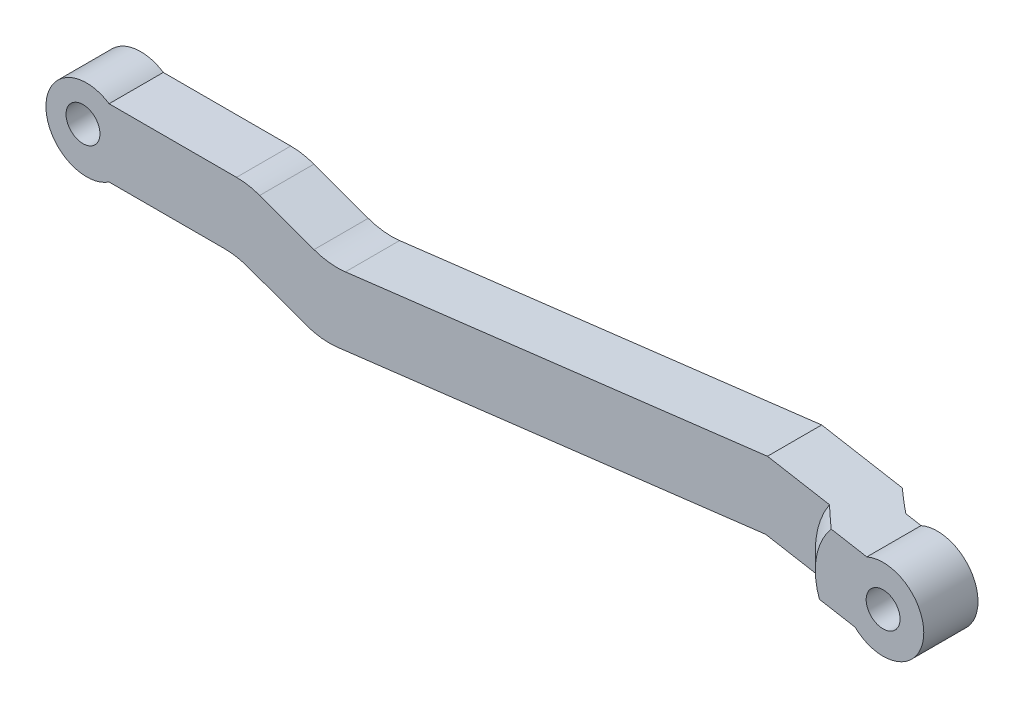
ISO-10303-21;
HEADER;
FILE_DESCRIPTION(('STEP AP214'),'2;1');
FILE_NAME('part.step','',(''),(''),'','','');
FILE_SCHEMA(('AUTOMOTIVE_DESIGN { 1 0 10303 214 1 1 1 1 }'));
ENDSEC;
DATA;
#1=APPLICATION_CONTEXT('core data for automotive mechanical design processes');
#2=APPLICATION_PROTOCOL_DEFINITION('international standard','automotive_design',2000,#1);
#3=PRODUCT_CONTEXT('',#1,'mechanical');
#4=PRODUCT('Part','Part','',(#3));
#5=PRODUCT_RELATED_PRODUCT_CATEGORY('part','',(#4));
#6=PRODUCT_DEFINITION_FORMATION('','',#4);
#7=PRODUCT_DEFINITION_CONTEXT('part definition',#1,'design');
#8=PRODUCT_DEFINITION('design','',#6,#7);
#9=PRODUCT_DEFINITION_SHAPE('','',#8);
#10=(LENGTH_UNIT() NAMED_UNIT(*) SI_UNIT(.MILLI.,.METRE.));
#11=(NAMED_UNIT(*) PLANE_ANGLE_UNIT() SI_UNIT($,.RADIAN.));
#12=(NAMED_UNIT(*) SI_UNIT($,.STERADIAN.) SOLID_ANGLE_UNIT());
#13=UNCERTAINTY_MEASURE_WITH_UNIT(LENGTH_MEASURE(1.E-05),#10,'distance_accuracy_value','');
#14=(GEOMETRIC_REPRESENTATION_CONTEXT(3) GLOBAL_UNCERTAINTY_ASSIGNED_CONTEXT((#13)) GLOBAL_UNIT_ASSIGNED_CONTEXT((#10,
#11,#12)) REPRESENTATION_CONTEXT('',''));
#15=CARTESIAN_POINT('',(0.,0.,0.));
#16=DIRECTION('',(0.,0.,1.));
#17=DIRECTION('',(1.,0.,0.));
#18=AXIS2_PLACEMENT_3D('',#15,#16,#17);
#19=CARTESIAN_POINT('',(0.,0.,4.));
#20=DIRECTION('',(0.,0.,-1.));
#21=DIRECTION('',(-1.,0.,0.));
#22=AXIS2_PLACEMENT_3D('',#19,#20,#21);
#23=CYLINDRICAL_SURFACE('',#22,6.00000000001086);
#24=CARTESIAN_POINT('',(0.,0.,-1.5));
#25=DIRECTION('',(0.,0.,-1.));
#26=DIRECTION('',(-1.,0.,0.));
#27=AXIS2_PLACEMENT_3D('',#24,#25,#26);
#28=CIRCLE('',#27,6.00000000001086);
#29=CARTESIAN_POINT('',(-2.39799691900909,5.49996461593647,-1.5));
#30=VERTEX_POINT('',#29);
#31=CARTESIAN_POINT('',(-4.13447869579307,-4.34811291419606,-1.5));
#32=VERTEX_POINT('',#31);
#33=EDGE_CURVE('E183',#30,#32,#28,.T.);
#34=ORIENTED_EDGE('',*,*,#33,.F.);
#35=DIRECTION('',(0.,0.,-1.));
#36=VECTOR('',#35,1.);
#37=CARTESIAN_POINT('',(-2.3979969189946,5.49996461590325,4.));
#38=LINE('',#37,#36);
#39=CARTESIAN_POINT('',(-2.39799691900909,5.49996461593647,6.50000000000001));
#40=VERTEX_POINT('',#39);
#41=EDGE_CURVE('E179',#40,#30,#38,.T.);
#42=ORIENTED_EDGE('',*,*,#41,.F.);
#43=CARTESIAN_POINT('',(0.,0.,6.5));
#44=DIRECTION('',(0.,0.,-1.));
#45=DIRECTION('',(-1.,0.,0.));
#46=AXIS2_PLACEMENT_3D('',#43,#44,#45);
#47=CIRCLE('',#46,6.00000000001992);
#48=CARTESIAN_POINT('',(-4.13447869577433,-4.34811291417636,6.5));
#49=VERTEX_POINT('',#48);
#50=EDGE_CURVE('E182',#40,#49,#47,.T.);
#51=ORIENTED_EDGE('',*,*,#50,.T.);
#52=DIRECTION('',(0.,0.,-1.));
#53=VECTOR('',#52,1.);
#54=CARTESIAN_POINT('',(-4.13447869579307,-4.34811291419606,4.));
#55=LINE('',#54,#53);
#56=EDGE_CURVE('E239',#49,#32,#55,.T.);
#57=ORIENTED_EDGE('',*,*,#56,.T.);
#58=EDGE_LOOP('',(#34,#42,#51,#57));
#59=FACE_BOUND('',#58,.T.);
#60=ADVANCED_FACE('F51',(#59),#23,.T.);
#61=CARTESIAN_POINT('',(-2.3979969189946,5.49996461590325,4.));
#62=DIRECTION('',(-0.173648177666931,-0.984807753012208,0.));
#63=DIRECTION('',(0.984807753012208,-0.173648177666931,0.));
#64=AXIS2_PLACEMENT_3D('',#61,#62,#63);
#65=PLANE('',#64);
#66=DIRECTION('',(0.984807753012208,-0.173648177666931,0.));
#67=VECTOR('',#66,1.);
#68=CARTESIAN_POINT('',(-2.3979969189946,5.49996461590325,-1.5));
#69=LINE('',#68,#67);
#70=CARTESIAN_POINT('',(-4.63700181292562,5.89476158864158,-1.5));
#71=VERTEX_POINT('',#70);
#72=EDGE_CURVE('E214',#71,#30,#69,.T.);
#73=ORIENTED_EDGE('',*,*,#72,.F.);
#74=CARTESIAN_POINT('',(-4.63700181292562,5.89476158864158,-1.5));
#75=CARTESIAN_POINT('',(-4.76732029656631,5.91774025339245,-1.59864307554178));
#76=CARTESIAN_POINT('',(-4.89691099085917,5.94059058924502,-1.69826879075981));
#77=CARTESIAN_POINT('',(-5.15479478304708,5.98606245969517,-1.89922594129117));
#78=CARTESIAN_POINT('',(-5.28308793961399,6.00868400463817,-2.000557298922));
#79=CARTESIAN_POINT('',(-5.66619408865113,6.07623595518873,-2.30666891352271));
#80=CARTESIAN_POINT('',(-5.91931681422967,6.12086832113869,-2.51363006363108));
#81=CARTESIAN_POINT('',(-6.42199481942784,6.20950401606384,-2.93188669002685));
#82=CARTESIAN_POINT('',(-6.67155056292691,6.25350742683349,-3.14318159385292));
#83=CARTESIAN_POINT('',(-7.0438147140486,6.31914764062678,-3.46268655799088));
#84=CARTESIAN_POINT('',(-7.16757803090698,6.34097045261088,-3.56963310752277));
#85=CARTESIAN_POINT('',(-7.41446957007137,6.3845040922742,-3.78427643626721));
#86=CARTESIAN_POINT('',(-7.5375978002994,6.40621492135029,-3.89197320608199));
#87=CARTESIAN_POINT('',(-7.66044443118978,6.4278760968654,-4.));
#88=B_SPLINE_CURVE_WITH_KNOTS('',3,(#74,#75,#76,#77,#78,#79,#80,#81,#82,#83,#84,#85,#86,#87),
.UNSPECIFIED.,.F.,.F.,(4,2,2,2,2,2,4),(0.,0.495136353628857,0.990250217252274,1.98016159083709,
2.96994303499135,3.46499656313936,3.96004390102446),.UNSPECIFIED.);
#89=CARTESIAN_POINT('',(-7.66044443118978,6.4278760968654,-4.));
#90=VERTEX_POINT('',#89);
#91=EDGE_CURVE('E319',#71,#90,#88,.T.);
#92=ORIENTED_EDGE('',*,*,#91,.T.);
#93=DIRECTION('',(-0.984807753012208,0.173648177666931,0.));
#94=VECTOR('',#93,1.);
#95=CARTESIAN_POINT('',(-2.3979969189946,5.49996461590325,-4.));
#96=LINE('',#95,#94);
#97=CARTESIAN_POINT('',(-19.5610523914674,8.52627436709628,-4.));
#98=VERTEX_POINT('',#97);
#99=EDGE_CURVE('E216',#90,#98,#96,.T.);
#100=ORIENTED_EDGE('',*,*,#99,.T.);
#101=DIRECTION('',(0.,0.,-1.));
#102=VECTOR('',#101,1.);
#103=CARTESIAN_POINT('',(-19.5610523914674,8.52627436709628,4.));
#104=LINE('',#103,#102);
#105=CARTESIAN_POINT('',(-19.5610523914674,8.52627436709628,4.));
#106=VERTEX_POINT('',#105);
#107=EDGE_CURVE('E188',#106,#98,#104,.T.);
#108=ORIENTED_EDGE('',*,*,#107,.F.);
#109=DIRECTION('',(-0.984807753012208,0.173648177666931,0.));
#110=VECTOR('',#109,1.);
#111=CARTESIAN_POINT('',(-2.3979969189946,5.49996461590325,4.));
#112=LINE('',#111,#110);
#113=CARTESIAN_POINT('',(-10.41414929456,6.91342856118569,4.));
#114=VERTEX_POINT('',#113);
#115=EDGE_CURVE('E217',#114,#106,#112,.T.);
#116=ORIENTED_EDGE('',*,*,#115,.F.);
#117=CARTESIAN_POINT('',(-10.41414929456,6.91342856118569,4.));
#118=CARTESIAN_POINT('',(-10.1872039291095,6.87341197011002,4.21119252457082));
#119=CARTESIAN_POINT('',(-9.95977189127952,6.83330956556309,4.421848306276));
#120=CARTESIAN_POINT('',(-9.50373627460469,6.75289818217929,4.84182529317093));
#121=CARTESIAN_POINT('',(-9.2751327527648,6.71258921339394,5.05114656220699));
#122=CARTESIAN_POINT('',(-8.81653066480646,6.63172529187765,5.4682169959713));
#123=CARTESIAN_POINT('',(-8.58653207764933,6.59117033543702,5.6759661368839));
#124=CARTESIAN_POINT('',(-8.12483490156985,6.5097606663773,6.08952940824265));
#125=CARTESIAN_POINT('',(-7.89313623095548,6.4689059393537,6.29534344460506));
#126=CARTESIAN_POINT('',(-7.66044443118978,6.4278760968654,6.50000000000016));
#127=B_SPLINE_CURVE_WITH_KNOTS('',3,(#117,#118,#119,#120,#121,#122,#123,#124,#125,#126),
.UNSPECIFIED.,.F.,.F.,(4,2,2,2,4),(0.,0.937748968141956,1.87545273026997,2.81317066904517,
3.7509339658266),.UNSPECIFIED.);
#128=CARTESIAN_POINT('',(-7.66044443118978,6.4278760968654,6.5));
#129=VERTEX_POINT('',#128);
#130=EDGE_CURVE('E203',#114,#129,#127,.T.);
#131=ORIENTED_EDGE('',*,*,#130,.T.);
#132=DIRECTION('',(0.98480775301319,-0.173648177661364,0.));
#133=VECTOR('',#132,1.);
#134=CARTESIAN_POINT('',(-2.39799691900909,5.49996461593647,6.5));
#135=LINE('',#134,#133);
#136=EDGE_CURVE('E195',#129,#40,#135,.T.);
#137=ORIENTED_EDGE('',*,*,#136,.T.);
#138=ORIENTED_EDGE('',*,*,#41,.T.);
#139=EDGE_LOOP('',(#73,#92,#100,#108,#116,#131,#137,#138));
#140=FACE_BOUND('',#139,.T.);
#141=ADVANCED_FACE('F200',(#140),#65,.F.);
#142=CARTESIAN_POINT('',(-19.5610523914674,8.52627436709628,4.));
#143=DIRECTION('',(0.120779117636236,-0.992679406829321,0.));
#144=DIRECTION('',(0.992679406829321,0.120779117636236,0.));
#145=AXIS2_PLACEMENT_3D('',#142,#143,#144);
#146=PLANE('',#145);
#147=DIRECTION('',(-0.992679406829321,-0.120779117636236,0.));
#148=VECTOR('',#147,1.);
#149=CARTESIAN_POINT('',(-19.5610523914674,8.52627436709628,-4.));
#150=LINE('',#149,#148);
#151=CARTESIAN_POINT('',(-81.8217203359611,0.951030551172543,-4.));
#152=VERTEX_POINT('',#151);
#153=EDGE_CURVE('E241',#98,#152,#150,.T.);
#154=ORIENTED_EDGE('',*,*,#153,.T.);
#155=DIRECTION('',(0.,0.,-1.));
#156=VECTOR('',#155,1.);
#157=CARTESIAN_POINT('',(-81.8217203359611,0.951030551172543,4.));
#158=LINE('',#157,#156);
#159=CARTESIAN_POINT('',(-81.8217203359611,0.951030551172543,4.));
#160=VERTEX_POINT('',#159);
#161=EDGE_CURVE('E352',#152,#160,#158,.F.);
#162=ORIENTED_EDGE('',*,*,#161,.T.);
#163=DIRECTION('',(-0.992679406829321,-0.120779117636236,0.));
#164=VECTOR('',#163,1.);
#165=CARTESIAN_POINT('',(-19.5610523914674,8.52627436709628,4.));
#166=LINE('',#165,#164);
#167=EDGE_CURVE('E219',#106,#160,#166,.T.);
#168=ORIENTED_EDGE('',*,*,#167,.F.);
#169=ORIENTED_EDGE('',*,*,#107,.T.);
#170=EDGE_LOOP('',(#154,#162,#168,#169));
#171=FACE_BOUND('',#170,.T.);
#172=ADVANCED_FACE('F370',(#171),#146,.F.);
#173=CARTESIAN_POINT('',(-84.1991677906299,0.661766964332774,4.));
#174=DIRECTION('',(-0.34202014332567,-0.939692620785908,0.));
#175=DIRECTION('',(0.939692620785908,-0.34202014332567,0.));
#176=AXIS2_PLACEMENT_3D('',#173,#174,#175);
#177=PLANE('',#176);
#178=DIRECTION('',(-0.939692620785908,0.34202014332567,0.));
#179=VECTOR('',#178,1.);
#180=CARTESIAN_POINT('',(-84.1991677906299,0.661766964332774,4.));
#181=LINE('',#180,#179);
#182=CARTESIAN_POINT('',(-86.4497129455801,1.48089841160667,4.));
#183=VERTEX_POINT('',#182);
#184=CARTESIAN_POINT('',(-94.4614334702856,4.39692620785907,4.));
#185=VERTEX_POINT('',#184);
#186=EDGE_CURVE('E223',#183,#185,#181,.T.);
#187=ORIENTED_EDGE('',*,*,#186,.F.);
#188=DIRECTION('',(0.,0.,-1.));
#189=VECTOR('',#188,1.);
#190=CARTESIAN_POINT('',(-86.4497129455801,1.48089841160667,-4.));
#191=LINE('',#190,#189);
#192=CARTESIAN_POINT('',(-86.4497129455801,1.48089841160667,-4.));
#193=VERTEX_POINT('',#192);
#194=EDGE_CURVE('E349',#183,#193,#191,.T.);
#195=ORIENTED_EDGE('',*,*,#194,.T.);
#196=DIRECTION('',(-0.939692620785908,0.34202014332567,0.));
#197=VECTOR('',#196,1.);
#198=CARTESIAN_POINT('',(-84.1991677906299,0.661766964332774,-4.));
#199=LINE('',#198,#197);
#200=CARTESIAN_POINT('',(-94.4614334702856,4.39692620785907,-4.));
#201=VERTEX_POINT('',#200);
#202=EDGE_CURVE('E244',#193,#201,#199,.T.);
#203=ORIENTED_EDGE('',*,*,#202,.T.);
#204=DIRECTION('',(0.,0.,-1.));
#205=VECTOR('',#204,1.);
#206=CARTESIAN_POINT('',(-94.4614334702856,4.39692620785907,4.));
#207=LINE('',#206,#205);
#208=EDGE_CURVE('E347',#201,#185,#207,.F.);
#209=ORIENTED_EDGE('',*,*,#208,.T.);
#210=EDGE_LOOP('',(#187,#195,#203,#209));
#211=FACE_BOUND('',#210,.T.);
#212=ADVANCED_FACE('F378',(#211),#177,.F.);
#213=CARTESIAN_POINT('',(-96.1183650964577,4.99999999999999,4.));
#214=DIRECTION('',(0.,-1.,0.));
#215=DIRECTION('',(1.,0.,0.));
#216=AXIS2_PLACEMENT_3D('',#213,#214,#215);
#217=PLANE('',#216);
#218=DIRECTION('',(-1.,0.,0.));
#219=VECTOR('',#218,1.);
#220=CARTESIAN_POINT('',(-96.1183650964577,4.99999999999999,4.));
#221=LINE('',#220,#219);
#222=CARTESIAN_POINT('',(-97.8816349035423,4.99999999999999,4.));
#223=VERTEX_POINT('',#222);
#224=CARTESIAN_POINT('',(-116.683375209645,5.,4.));
#225=VERTEX_POINT('',#224);
#226=EDGE_CURVE('E225',#223,#225,#221,.T.);
#227=ORIENTED_EDGE('',*,*,#226,.F.);
#228=DIRECTION('',(0.,0.,-1.));
#229=VECTOR('',#228,1.);
#230=CARTESIAN_POINT('',(-97.8816349035423,4.99999999999999,4.));
#231=LINE('',#230,#229);
#232=CARTESIAN_POINT('',(-97.8816349035423,4.99999999999999,-4.));
#233=VERTEX_POINT('',#232);
#234=EDGE_CURVE('E354',#223,#233,#231,.T.);
#235=ORIENTED_EDGE('',*,*,#234,.T.);
#236=DIRECTION('',(-1.,0.,0.));
#237=VECTOR('',#236,1.);
#238=CARTESIAN_POINT('',(-96.1183650964577,4.99999999999999,-4.));
#239=LINE('',#238,#237);
#240=CARTESIAN_POINT('',(-116.683375209645,5.,-4.));
#241=VERTEX_POINT('',#240);
#242=EDGE_CURVE('E247',#233,#241,#239,.T.);
#243=ORIENTED_EDGE('',*,*,#242,.T.);
#244=DIRECTION('',(0.,0.,-1.));
#245=VECTOR('',#244,1.);
#246=CARTESIAN_POINT('',(-116.683375209645,5.,4.));
#247=LINE('',#246,#245);
#248=EDGE_CURVE('E267',#225,#241,#247,.T.);
#249=ORIENTED_EDGE('',*,*,#248,.F.);
#250=EDGE_LOOP('',(#227,#235,#243,#249));
#251=FACE_BOUND('',#250,.T.);
#252=ADVANCED_FACE('F384',(#251),#217,.F.);
#253=CARTESIAN_POINT('',(-120.,0.,4.));
#254=DIRECTION('',(0.,0.,-1.));
#255=DIRECTION('',(-1.,0.,0.));
#256=AXIS2_PLACEMENT_3D('',#253,#254,#255);
#257=CYLINDRICAL_SURFACE('',#256,5.99999999999999);
#258=CARTESIAN_POINT('',(-120.,0.,-4.));
#259=DIRECTION('',(0.,0.,1.));
#260=DIRECTION('',(1.,0.,0.));
#261=AXIS2_PLACEMENT_3D('',#258,#259,#260);
#262=CIRCLE('',#261,5.99999999999999);
#263=CARTESIAN_POINT('',(-116.683375209645,-5.00000000000002,-4.));
#264=VERTEX_POINT('',#263);
#265=EDGE_CURVE('E249',#241,#264,#262,.T.);
#266=ORIENTED_EDGE('',*,*,#265,.T.);
#267=DIRECTION('',(0.,0.,-1.));
#268=VECTOR('',#267,1.);
#269=CARTESIAN_POINT('',(-116.683375209645,-5.00000000000002,4.));
#270=LINE('',#269,#268);
#271=CARTESIAN_POINT('',(-116.683375209645,-5.00000000000002,4.));
#272=VERTEX_POINT('',#271);
#273=EDGE_CURVE('E264',#272,#264,#270,.T.);
#274=ORIENTED_EDGE('',*,*,#273,.F.);
#275=CARTESIAN_POINT('',(-120.,0.,4.));
#276=DIRECTION('',(0.,0.,1.));
#277=DIRECTION('',(1.,0.,0.));
#278=AXIS2_PLACEMENT_3D('',#275,#276,#277);
#279=CIRCLE('',#278,5.99999999999999);
#280=EDGE_CURVE('E227',#225,#272,#279,.T.);
#281=ORIENTED_EDGE('',*,*,#280,.F.);
#282=ORIENTED_EDGE('',*,*,#248,.T.);
#283=EDGE_LOOP('',(#266,#274,#281,#282));
#284=FACE_BOUND('',#283,.T.);
#285=ADVANCED_FACE('F390',(#284),#257,.T.);
#286=CARTESIAN_POINT('',(-97.8816349035423,-5.00000000000001,4.));
#287=DIRECTION('',(0.,1.,0.));
#288=DIRECTION('',(-1.,0.,0.));
#289=AXIS2_PLACEMENT_3D('',#286,#287,#288);
#290=PLANE('',#289);
#291=DIRECTION('',(1.,0.,0.));
#292=VECTOR('',#291,1.);
#293=CARTESIAN_POINT('',(-97.8816349035423,-5.00000000000001,-4.));
#294=LINE('',#293,#292);
#295=CARTESIAN_POINT('',(-99.644904710627,-5.00000000000001,-4.));
#296=VERTEX_POINT('',#295);
#297=EDGE_CURVE('E251',#264,#296,#294,.T.);
#298=ORIENTED_EDGE('',*,*,#297,.T.);
#299=DIRECTION('',(0.,0.,-1.));
#300=VECTOR('',#299,1.);
#301=CARTESIAN_POINT('',(-99.644904710627,-5.00000000000001,4.));
#302=LINE('',#301,#300);
#303=CARTESIAN_POINT('',(-99.644904710627,-5.00000000000001,4.));
#304=VERTEX_POINT('',#303);
#305=EDGE_CURVE('E66',#296,#304,#302,.F.);
#306=ORIENTED_EDGE('',*,*,#305,.T.);
#307=DIRECTION('',(1.,0.,0.));
#308=VECTOR('',#307,1.);
#309=CARTESIAN_POINT('',(-97.8816349035423,-5.00000000000001,4.));
#310=LINE('',#309,#308);
#311=EDGE_CURVE('E229',#272,#304,#310,.T.);
#312=ORIENTED_EDGE('',*,*,#311,.F.);
#313=ORIENTED_EDGE('',*,*,#273,.T.);
#314=EDGE_LOOP('',(#298,#306,#312,#313));
#315=FACE_BOUND('',#314,.T.);
#316=ADVANCED_FACE('F392',(#315),#290,.F.);
#317=CARTESIAN_POINT('',(-85.3688240689364,-9.5542906908002,4.));
#318=DIRECTION('',(0.342020143325669,0.939692620785908,0.));
#319=DIRECTION('',(-0.939692620785908,0.342020143325669,0.));
#320=AXIS2_PLACEMENT_3D('',#317,#318,#319);
#321=PLANE('',#320);
#322=DIRECTION('',(0.939692620785908,-0.342020143325669,0.));
#323=VECTOR('',#322,1.);
#324=CARTESIAN_POINT('',(-85.3688240689364,-9.5542906908002,-4.));
#325=LINE('',#324,#323);
#326=CARTESIAN_POINT('',(-96.2247032773703,-5.60307379214093,-4.));
#327=VERTEX_POINT('',#326);
#328=CARTESIAN_POINT('',(-87.6193692238867,-8.7351592435263,-4.));
#329=VERTEX_POINT('',#328);
#330=EDGE_CURVE('E253',#327,#329,#325,.T.);
#331=ORIENTED_EDGE('',*,*,#330,.T.);
#332=DIRECTION('',(0.,0.,-1.));
#333=VECTOR('',#332,1.);
#334=CARTESIAN_POINT('',(-87.6193692238867,-8.7351592435263,4.));
#335=LINE('',#334,#333);
#336=CARTESIAN_POINT('',(-87.6193692238867,-8.7351592435263,4.));
#337=VERTEX_POINT('',#336);
#338=EDGE_CURVE('E341',#329,#337,#335,.F.);
#339=ORIENTED_EDGE('',*,*,#338,.T.);
#340=DIRECTION('',(0.939692620785908,-0.342020143325669,0.));
#341=VECTOR('',#340,1.);
#342=CARTESIAN_POINT('',(-85.3688240689364,-9.5542906908002,4.));
#343=LINE('',#342,#341);
#344=CARTESIAN_POINT('',(-96.2247032773703,-5.60307379214093,4.));
#345=VERTEX_POINT('',#344);
#346=EDGE_CURVE('E231',#345,#337,#343,.T.);
#347=ORIENTED_EDGE('',*,*,#346,.F.);
#348=DIRECTION('',(0.,0.,-1.));
#349=VECTOR('',#348,1.);
#350=CARTESIAN_POINT('',(-96.2247032773703,-5.60307379214093,-4.));
#351=LINE('',#350,#349);
#352=EDGE_CURVE('E338',#345,#327,#351,.T.);
#353=ORIENTED_EDGE('',*,*,#352,.T.);
#354=EDGE_LOOP('',(#331,#339,#347,#353));
#355=FACE_BOUND('',#354,.T.);
#356=ADVANCED_FACE('F400',(#355),#321,.F.);
#357=CARTESIAN_POINT('',(-19.8312577290209,-1.58034726041906,4.));
#358=DIRECTION('',(-0.120779117636236,0.992679406829321,0.));
#359=DIRECTION('',(-0.992679406829321,-0.120779117636236,0.));
#360=AXIS2_PLACEMENT_3D('',#357,#358,#359);
#361=PLANE('',#360);
#362=DIRECTION('',(0.992679406829321,0.120779117636236,0.));
#363=VECTOR('',#362,1.);
#364=CARTESIAN_POINT('',(-19.8312577290209,-1.58034726041906,4.));
#365=LINE('',#364,#363);
#366=CARTESIAN_POINT('',(-82.9913766142676,-9.26502710396044,4.));
#367=VERTEX_POINT('',#366);
#368=CARTESIAN_POINT('',(-19.8312577290209,-1.58034726041906,4.));
#369=VERTEX_POINT('',#368);
#370=EDGE_CURVE('E234',#367,#369,#365,.T.);
#371=ORIENTED_EDGE('',*,*,#370,.F.);
#372=DIRECTION('',(0.,0.,-1.));
#373=VECTOR('',#372,1.);
#374=CARTESIAN_POINT('',(-82.9913766142676,-9.26502710396044,4.));
#375=LINE('',#374,#373);
#376=CARTESIAN_POINT('',(-82.9913766142676,-9.26502710396044,-4.));
#377=VERTEX_POINT('',#376);
#378=EDGE_CURVE('E331',#367,#377,#375,.T.);
#379=ORIENTED_EDGE('',*,*,#378,.T.);
#380=DIRECTION('',(0.992679406829321,0.120779117636236,0.));
#381=VECTOR('',#380,1.);
#382=CARTESIAN_POINT('',(-19.8312577290209,-1.58034726041906,-4.));
#383=LINE('',#382,#381);
#384=CARTESIAN_POINT('',(-19.8312577290209,-1.58034726041906,-4.));
#385=VERTEX_POINT('',#384);
#386=EDGE_CURVE('E256',#377,#385,#383,.T.);
#387=ORIENTED_EDGE('',*,*,#386,.T.);
#388=DIRECTION('',(0.,0.,-1.));
#389=VECTOR('',#388,1.);
#390=CARTESIAN_POINT('',(-19.8312577290209,-1.58034726041906,4.));
#391=LINE('',#390,#389);
#392=EDGE_CURVE('E261',#369,#385,#391,.T.);
#393=ORIENTED_EDGE('',*,*,#392,.F.);
#394=EDGE_LOOP('',(#371,#379,#387,#393));
#395=FACE_BOUND('',#394,.T.);
#396=ADVANCED_FACE('F408',(#395),#361,.F.);
#397=CARTESIAN_POINT('',(-4.13447869579307,-4.34811291419606,4.));
#398=DIRECTION('',(0.173648177666931,0.984807753012208,0.));
#399=DIRECTION('',(-0.984807753012208,0.173648177666931,0.));
#400=AXIS2_PLACEMENT_3D('',#397,#398,#399);
#401=PLANE('',#400);
#402=DIRECTION('',(0.984807753012208,-0.173648177666931,0.));
#403=VECTOR('',#402,1.);
#404=CARTESIAN_POINT('',(-4.13447869579307,-4.34811291419606,-4.));
#405=LINE('',#404,#403);
#406=CARTESIAN_POINT('',(-9.39692620785908,-3.42020143325669,-4.));
#407=VERTEX_POINT('',#406);
#408=EDGE_CURVE('E220',#385,#407,#405,.T.);
#409=ORIENTED_EDGE('',*,*,#408,.T.);
#410=CARTESIAN_POINT('',(-9.39692620785908,-3.42020143325669,-4.));
#411=CARTESIAN_POINT('',(-9.27407957696871,-3.4418626087718,-3.89197320608199));
#412=CARTESIAN_POINT('',(-9.15095134674068,-3.46357343784788,-3.78427643626721));
#413=CARTESIAN_POINT('',(-8.90405980757629,-3.5071070775112,-3.56963310752277));
#414=CARTESIAN_POINT('',(-8.7802964907179,-3.52892988949531,-3.46268655799088));
#415=CARTESIAN_POINT('',(-8.40803233959621,-3.59457010328859,-3.14318159385292));
#416=CARTESIAN_POINT('',(-8.15847659609715,-3.63857351405824,-2.93188669002685));
#417=CARTESIAN_POINT('',(-7.65579859089898,-3.72720920898339,-2.51363006363108));
#418=CARTESIAN_POINT('',(-7.40267586532043,-3.77184157493335,-2.30666891352271));
#419=CARTESIAN_POINT('',(-7.01956971628329,-3.83939352548392,-2.000557298922));
#420=CARTESIAN_POINT('',(-6.89127655971639,-3.86201507042692,-1.89922594129117));
#421=CARTESIAN_POINT('',(-6.63339276752847,-3.90748694087706,-1.69826879075981));
#422=CARTESIAN_POINT('',(-6.50380207323561,-3.93033727672964,-1.59864307554178));
#423=CARTESIAN_POINT('',(-6.37348358959492,-3.9533159414805,-1.5));
#424=B_SPLINE_CURVE_WITH_KNOTS('',3,(#410,#411,#412,#413,#414,#415,#416,#417,#418,#419,#420,
#421,#422,#423),.UNSPECIFIED.,.F.,.F.,(4,2,2,2,2,2,4),(0.,0.495047337885099,0.990100866033114,
1.97988231018737,2.96979368377219,3.4649075473956,3.96004390102446),.UNSPECIFIED.);
#425=CARTESIAN_POINT('',(-6.37348358959492,-3.9533159414805,-1.5));
#426=VERTEX_POINT('',#425);
#427=EDGE_CURVE('E325',#407,#426,#424,.T.);
#428=ORIENTED_EDGE('',*,*,#427,.T.);
#429=DIRECTION('',(-0.984807753012208,0.173648177666931,0.));
#430=VECTOR('',#429,1.);
#431=CARTESIAN_POINT('',(-4.13447869579307,-4.34811291419606,-1.5));
#432=LINE('',#431,#430);
#433=EDGE_CURVE('E273',#32,#426,#432,.T.);
#434=ORIENTED_EDGE('',*,*,#433,.F.);
#435=ORIENTED_EDGE('',*,*,#56,.F.);
#436=DIRECTION('',(-0.984807753012699,0.173648177664147,0.));
#437=VECTOR('',#436,1.);
#438=CARTESIAN_POINT('',(-9.39692620785908,-3.42020143325669,6.5));
#439=LINE('',#438,#437);
#440=CARTESIAN_POINT('',(-9.39692620785908,-3.42020143325669,6.5));
#441=VERTEX_POINT('',#440);
#442=EDGE_CURVE('E198',#49,#441,#439,.T.);
#443=ORIENTED_EDGE('',*,*,#442,.T.);
#444=CARTESIAN_POINT('',(-9.39692620785908,-3.42020143325669,6.50000000000015));
#445=CARTESIAN_POINT('',(-9.62961800762478,-3.37917159076838,6.29534344460506));
#446=CARTESIAN_POINT('',(-9.86131667823915,-3.33831686374479,6.08952940824265));
#447=CARTESIAN_POINT('',(-10.3230138543186,-3.25690719468507,5.6759661368839));
#448=CARTESIAN_POINT('',(-10.5530124414758,-3.21635223824444,5.4682169959713));
#449=CARTESIAN_POINT('',(-11.0116145294341,-3.13548831672814,5.05114656220699));
#450=CARTESIAN_POINT('',(-11.240218051274,-3.09517934794279,4.84182529317093));
#451=CARTESIAN_POINT('',(-11.6962536679488,-3.014767964559,4.421848306276));
#452=CARTESIAN_POINT('',(-11.9236857057788,-2.97466556001206,4.21119252457081));
#453=CARTESIAN_POINT('',(-12.1506310712293,-2.93464896893639,4.));
#454=B_SPLINE_CURVE_WITH_KNOTS('',3,(#444,#445,#446,#447,#448,#449,#450,#451,#452,#453),
.UNSPECIFIED.,.F.,.F.,(4,2,2,2,4),(0.,0.93776329678142,1.87548123555663,2.81318499768464,
3.7509339658266),.UNSPECIFIED.);
#455=CARTESIAN_POINT('',(-12.1506310712293,-2.93464896893639,4.));
#456=VERTEX_POINT('',#455);
#457=EDGE_CURVE('E278',#441,#456,#454,.T.);
#458=ORIENTED_EDGE('',*,*,#457,.T.);
#459=DIRECTION('',(0.984807753012208,-0.173648177666931,0.));
#460=VECTOR('',#459,1.);
#461=CARTESIAN_POINT('',(-4.13447869579307,-4.34811291419606,4.));
#462=LINE('',#461,#460);
#463=EDGE_CURVE('E236',#369,#456,#462,.T.);
#464=ORIENTED_EDGE('',*,*,#463,.F.);
#465=ORIENTED_EDGE('',*,*,#392,.T.);
#466=EDGE_LOOP('',(#409,#428,#434,#435,#443,#458,#464,#465));
#467=FACE_BOUND('',#466,.T.);
#468=ADVANCED_FACE('F292',(#467),#401,.F.);
#469=CARTESIAN_POINT('',(0.,0.,4.));
#470=DIRECTION('',(0.,0.,1.));
#471=DIRECTION('',(1.,0.,0.));
#472=AXIS2_PLACEMENT_3D('',#469,#470,#471);
#473=PLANE('',#472);
#474=CARTESIAN_POINT('',(-120.5348587475,0.479304543789961,4.));
#475=DIRECTION('',(0.,0.,1.));
#476=DIRECTION('',(1.,0.,0.));
#477=AXIS2_PLACEMENT_3D('',#474,#475,#476);
#478=CIRCLE('',#477,2.5003043970122);
#479=CARTESIAN_POINT('',(-118.034554350488,0.479304543789961,4.));
#480=VERTEX_POINT('',#479);
#481=EDGE_CURVE('E204',#480,#480,#478,.T.);
#482=ORIENTED_EDGE('',*,*,#481,.F.);
#483=EDGE_LOOP('',(#482));
#484=FACE_BOUND('',#483,.T.);
#485=ORIENTED_EDGE('',*,*,#346,.T.);
#486=CARTESIAN_POINT('',(-84.19916779063,0.661766964332773,4.));
#487=DIRECTION('',(0.,0.,1.));
#488=DIRECTION('',(1.,0.,0.));
#489=AXIS2_PLACEMENT_3D('',#486,#487,#488);
#490=CIRCLE('',#489,10.);
#491=EDGE_CURVE('E344',#337,#367,#490,.T.);
#492=ORIENTED_EDGE('',*,*,#491,.T.);
#493=ORIENTED_EDGE('',*,*,#370,.T.);
#494=ORIENTED_EDGE('',*,*,#463,.T.);
#495=CARTESIAN_POINT('',(0.,0.,4.));
#496=DIRECTION('',(0.,0.,1.));
#497=DIRECTION('',(1.,0.,0.));
#498=AXIS2_PLACEMENT_3D('',#495,#496,#497);
#499=CIRCLE('',#498,12.5000000000001);
#500=EDGE_CURVE('E276',#456,#114,#499,.F.);
#501=ORIENTED_EDGE('',*,*,#500,.T.);
#502=ORIENTED_EDGE('',*,*,#115,.T.);
#503=ORIENTED_EDGE('',*,*,#167,.T.);
#504=CARTESIAN_POINT('',(-83.0295115123235,10.8778246194657,4.));
#505=DIRECTION('',(0.,0.,1.));
#506=DIRECTION('',(1.,0.,0.));
#507=AXIS2_PLACEMENT_3D('',#504,#505,#506);
#508=CIRCLE('',#507,10.);
#509=EDGE_CURVE('E12',#160,#183,#508,.F.);
#510=ORIENTED_EDGE('',*,*,#509,.T.);
#511=ORIENTED_EDGE('',*,*,#186,.T.);
#512=CARTESIAN_POINT('',(-97.8816349035423,-5.00000000000001,4.));
#513=DIRECTION('',(0.,0.,1.));
#514=DIRECTION('',(1.,0.,0.));
#515=AXIS2_PLACEMENT_3D('',#512,#513,#514);
#516=CIRCLE('',#515,10.);
#517=EDGE_CURVE('E74',#185,#223,#516,.T.);
#518=ORIENTED_EDGE('',*,*,#517,.T.);
#519=ORIENTED_EDGE('',*,*,#226,.T.);
#520=ORIENTED_EDGE('',*,*,#280,.T.);
#521=ORIENTED_EDGE('',*,*,#311,.T.);
#522=CARTESIAN_POINT('',(-99.644904710627,-15.,4.));
#523=DIRECTION('',(0.,0.,1.));
#524=DIRECTION('',(1.,0.,0.));
#525=AXIS2_PLACEMENT_3D('',#522,#523,#524);
#526=CIRCLE('',#525,10.);
#527=EDGE_CURVE('E359',#304,#345,#526,.F.);
#528=ORIENTED_EDGE('',*,*,#527,.T.);
#529=EDGE_LOOP('',(#485,#492,#493,#494,#501,#502,#503,#510,#511,#518,#519,#520,#521,#528));
#530=FACE_BOUND('',#529,.T.);
#531=ADVANCED_FACE('F376',(#484,#530),#473,.T.);
#532=CARTESIAN_POINT('',(0.,0.,-4.));
#533=DIRECTION('',(0.,0.,1.));
#534=DIRECTION('',(1.,0.,0.));
#535=AXIS2_PLACEMENT_3D('',#532,#533,#534);
#536=PLANE('',#535);
#537=CARTESIAN_POINT('',(-120.5348587475,0.479304543789961,-4.));
#538=DIRECTION('',(0.,0.,-1.));
#539=DIRECTION('',(-1.,0.,0.));
#540=AXIS2_PLACEMENT_3D('',#537,#538,#539);
#541=CIRCLE('',#540,2.5003043970122);
#542=CARTESIAN_POINT('',(-123.035163144512,0.479304543789961,-4.));
#543=VERTEX_POINT('',#542);
#544=EDGE_CURVE('E472',#543,#543,#541,.T.);
#545=ORIENTED_EDGE('',*,*,#544,.F.);
#546=EDGE_LOOP('',(#545));
#547=FACE_BOUND('',#546,.T.);
#548=ORIENTED_EDGE('',*,*,#386,.F.);
#549=CARTESIAN_POINT('',(-84.19916779063,0.661766964332773,-4.));
#550=DIRECTION('',(0.,0.,1.));
#551=DIRECTION('',(1.,0.,0.));
#552=AXIS2_PLACEMENT_3D('',#549,#550,#551);
#553=CIRCLE('',#552,10.);
#554=EDGE_CURVE('E336',#377,#329,#553,.F.);
#555=ORIENTED_EDGE('',*,*,#554,.T.);
#556=ORIENTED_EDGE('',*,*,#330,.F.);
#557=CARTESIAN_POINT('',(-99.644904710627,-15.,-4.));
#558=DIRECTION('',(0.,0.,1.));
#559=DIRECTION('',(1.,0.,0.));
#560=AXIS2_PLACEMENT_3D('',#557,#558,#559);
#561=CIRCLE('',#560,10.);
#562=EDGE_CURVE('E357',#327,#296,#561,.T.);
#563=ORIENTED_EDGE('',*,*,#562,.T.);
#564=ORIENTED_EDGE('',*,*,#297,.F.);
#565=ORIENTED_EDGE('',*,*,#265,.F.);
#566=ORIENTED_EDGE('',*,*,#242,.F.);
#567=CARTESIAN_POINT('',(-97.8816349035423,-5.00000000000001,-4.));
#568=DIRECTION('',(0.,0.,1.));
#569=DIRECTION('',(1.,0.,0.));
#570=AXIS2_PLACEMENT_3D('',#567,#568,#569);
#571=CIRCLE('',#570,10.);
#572=EDGE_CURVE('E334',#233,#201,#571,.F.);
#573=ORIENTED_EDGE('',*,*,#572,.T.);
#574=ORIENTED_EDGE('',*,*,#202,.F.);
#575=CARTESIAN_POINT('',(-83.0295115123235,10.8778246194657,-4.));
#576=DIRECTION('',(0.,0.,1.));
#577=DIRECTION('',(1.,0.,0.));
#578=AXIS2_PLACEMENT_3D('',#575,#576,#577);
#579=CIRCLE('',#578,10.);
#580=EDGE_CURVE('E59',#193,#152,#579,.T.);
#581=ORIENTED_EDGE('',*,*,#580,.T.);
#582=ORIENTED_EDGE('',*,*,#153,.F.);
#583=ORIENTED_EDGE('',*,*,#99,.F.);
#584=CARTESIAN_POINT('',(0.,0.,-4.));
#585=DIRECTION('',(0.,0.,1.));
#586=DIRECTION('',(1.,0.,0.));
#587=AXIS2_PLACEMENT_3D('',#584,#585,#586);
#588=CIRCLE('',#587,10.);
#589=EDGE_CURVE('E187',#90,#407,#588,.T.);
#590=ORIENTED_EDGE('',*,*,#589,.T.);
#591=ORIENTED_EDGE('',*,*,#408,.F.);
#592=EDGE_LOOP('',(#548,#555,#556,#563,#564,#565,#566,#573,#574,#581,#582,#583,#590,#591));
#593=FACE_BOUND('',#592,.T.);
#594=ADVANCED_FACE('F364',(#547,#593),#536,.F.);
#595=CARTESIAN_POINT('',(0.,0.,-1.5));
#596=DIRECTION('',(0.,0.,-1.));
#597=DIRECTION('',(-1.,0.,0.));
#598=AXIS2_PLACEMENT_3D('',#595,#596,#597);
#599=PLANE('',#598);
#600=CARTESIAN_POINT('',(0.,0.,-1.5));
#601=DIRECTION('',(0.,0.,-1.));
#602=DIRECTION('',(-1.,0.,0.));
#603=AXIS2_PLACEMENT_3D('',#600,#601,#602);
#604=CIRCLE('',#603,2.50000000000859);
#605=CARTESIAN_POINT('',(-2.50000000000859,0.,-1.5));
#606=VERTEX_POINT('',#605);
#607=EDGE_CURVE('E207',#606,#606,#604,.T.);
#608=ORIENTED_EDGE('',*,*,#607,.F.);
#609=EDGE_LOOP('',(#608));
#610=FACE_BOUND('',#609,.T.);
#611=ORIENTED_EDGE('',*,*,#433,.T.);
#612=CARTESIAN_POINT('',(0.,0.,-1.5));
#613=DIRECTION('',(0.,0.,-1.));
#614=DIRECTION('',(-1.,0.,0.));
#615=AXIS2_PLACEMENT_3D('',#612,#613,#614);
#616=CIRCLE('',#615,7.49999999999998);
#617=EDGE_CURVE('E413',#426,#71,#616,.T.);
#618=ORIENTED_EDGE('',*,*,#617,.T.);
#619=ORIENTED_EDGE('',*,*,#72,.T.);
#620=ORIENTED_EDGE('',*,*,#33,.T.);
#621=EDGE_LOOP('',(#611,#618,#619,#620));
#622=FACE_BOUND('',#621,.T.);
#623=ADVANCED_FACE('F420',(#610,#622),#599,.T.);
#624=CARTESIAN_POINT('',(0.,0.,6.5));
#625=DIRECTION('',(0.,0.,-1.));
#626=DIRECTION('',(-1.,0.,0.));
#627=AXIS2_PLACEMENT_3D('',#624,#625,#626);
#628=PLANE('',#627);
#629=CARTESIAN_POINT('',(0.,0.,6.50000000000001));
#630=DIRECTION('',(0.,0.,-1.));
#631=DIRECTION('',(-1.,0.,0.));
#632=AXIS2_PLACEMENT_3D('',#629,#630,#631);
#633=CIRCLE('',#632,2.50000000000859);
#634=CARTESIAN_POINT('',(-2.50000000000859,0.,6.50000000000001));
#635=VERTEX_POINT('',#634);
#636=EDGE_CURVE('E473',#635,#635,#633,.T.);
#637=ORIENTED_EDGE('',*,*,#636,.T.);
#638=EDGE_LOOP('',(#637));
#639=FACE_BOUND('',#638,.T.);
#640=ORIENTED_EDGE('',*,*,#442,.F.);
#641=ORIENTED_EDGE('',*,*,#50,.F.);
#642=ORIENTED_EDGE('',*,*,#136,.F.);
#643=CARTESIAN_POINT('',(0.,0.,6.5));
#644=DIRECTION('',(0.,0.,-1.));
#645=DIRECTION('',(-1.,0.,0.));
#646=AXIS2_PLACEMENT_3D('',#643,#644,#645);
#647=CIRCLE('',#646,10.);
#648=EDGE_CURVE('E211',#441,#129,#647,.T.);
#649=ORIENTED_EDGE('',*,*,#648,.F.);
#650=EDGE_LOOP('',(#640,#641,#642,#649));
#651=FACE_BOUND('',#650,.T.);
#652=ADVANCED_FACE('F193',(#639,#651),#628,.F.);
#653=CARTESIAN_POINT('',(0.,0.,6.50000000000001));
#654=DIRECTION('',(0.,0.,-1.));
#655=DIRECTION('',(-1.,0.,0.));
#656=AXIS2_PLACEMENT_3D('',#653,#654,#655);
#657=CYLINDRICAL_SURFACE('',#656,2.50000000000859);
#658=ORIENTED_EDGE('',*,*,#607,.T.);
#659=EDGE_LOOP('',(#658));
#660=FACE_BOUND('',#659,.T.);
#661=ORIENTED_EDGE('',*,*,#636,.F.);
#662=EDGE_LOOP('',(#661));
#663=FACE_BOUND('',#662,.T.);
#664=ADVANCED_FACE('F428',(#660,#663),#657,.F.);
#665=CARTESIAN_POINT('',(-120.5348587475,0.479304543789961,6.50000000000001));
#666=DIRECTION('',(0.,0.,-1.));
#667=DIRECTION('',(-1.,0.,0.));
#668=AXIS2_PLACEMENT_3D('',#665,#666,#667);
#669=CYLINDRICAL_SURFACE('',#668,2.5003043970122);
#670=ORIENTED_EDGE('',*,*,#481,.T.);
#671=EDGE_LOOP('',(#670));
#672=FACE_BOUND('',#671,.T.);
#673=ORIENTED_EDGE('',*,*,#544,.T.);
#674=EDGE_LOOP('',(#673));
#675=FACE_BOUND('',#674,.T.);
#676=ADVANCED_FACE('F306',(#672,#675),#669,.F.);
#677=CARTESIAN_POINT('',(0.,0.,6.50000000000015));
#678=DIRECTION('',(0.,0.,-1.));
#679=DIRECTION('',(-1.,0.,0.));
#680=AXIS2_PLACEMENT_3D('',#677,#678,#679);
#681=CONICAL_SURFACE('',#680,10.,0.785398163397442);
#682=ORIENTED_EDGE('',*,*,#130,.F.);
#683=ORIENTED_EDGE('',*,*,#500,.F.);
#684=ORIENTED_EDGE('',*,*,#457,.F.);
#685=ORIENTED_EDGE('',*,*,#648,.T.);
#686=EDGE_LOOP('',(#682,#683,#684,#685));
#687=FACE_BOUND('',#686,.T.);
#688=ADVANCED_FACE('F297',(#687),#681,.T.);
#689=CARTESIAN_POINT('',(0.,0.,-1.5));
#690=DIRECTION('',(0.,0.,-1.));
#691=DIRECTION('',(-1.,0.,0.));
#692=AXIS2_PLACEMENT_3D('',#689,#690,#691);
#693=CONICAL_SURFACE('',#692,7.49999999999998,0.785398163397453);
#694=ORIENTED_EDGE('',*,*,#427,.F.);
#695=ORIENTED_EDGE('',*,*,#589,.F.);
#696=ORIENTED_EDGE('',*,*,#91,.F.);
#697=ORIENTED_EDGE('',*,*,#617,.F.);
#698=EDGE_LOOP('',(#694,#695,#696,#697));
#699=FACE_BOUND('',#698,.T.);
#700=ADVANCED_FACE('F305',(#699),#693,.F.);
#701=CARTESIAN_POINT('',(-84.19916779063,0.661766964332773,4.));
#702=DIRECTION('',(0.,0.,-1.));
#703=DIRECTION('',(-1.,0.,0.));
#704=AXIS2_PLACEMENT_3D('',#701,#702,#703);
#705=CYLINDRICAL_SURFACE('',#704,10.);
#706=ORIENTED_EDGE('',*,*,#491,.F.);
#707=ORIENTED_EDGE('',*,*,#338,.F.);
#708=ORIENTED_EDGE('',*,*,#554,.F.);
#709=ORIENTED_EDGE('',*,*,#378,.F.);
#710=EDGE_LOOP('',(#706,#707,#708,#709));
#711=FACE_BOUND('',#710,.T.);
#712=ADVANCED_FACE('F314',(#711),#705,.T.);
#713=CARTESIAN_POINT('',(-99.644904710627,-15.,4.));
#714=DIRECTION('',(0.,0.,1.));
#715=DIRECTION('',(1.,0.,0.));
#716=AXIS2_PLACEMENT_3D('',#713,#714,#715);
#717=CYLINDRICAL_SURFACE('',#716,10.);
#718=ORIENTED_EDGE('',*,*,#527,.F.);
#719=ORIENTED_EDGE('',*,*,#305,.F.);
#720=ORIENTED_EDGE('',*,*,#562,.F.);
#721=ORIENTED_EDGE('',*,*,#352,.F.);
#722=EDGE_LOOP('',(#718,#719,#720,#721));
#723=FACE_BOUND('',#722,.T.);
#724=ADVANCED_FACE('F397',(#723),#717,.F.);
#725=CARTESIAN_POINT('',(-83.0295115123235,10.8778246194657,4.));
#726=DIRECTION('',(0.,0.,1.));
#727=DIRECTION('',(1.,0.,0.));
#728=AXIS2_PLACEMENT_3D('',#725,#726,#727);
#729=CYLINDRICAL_SURFACE('',#728,10.);
#730=ORIENTED_EDGE('',*,*,#509,.F.);
#731=ORIENTED_EDGE('',*,*,#161,.F.);
#732=ORIENTED_EDGE('',*,*,#580,.F.);
#733=ORIENTED_EDGE('',*,*,#194,.F.);
#734=EDGE_LOOP('',(#730,#731,#732,#733));
#735=FACE_BOUND('',#734,.T.);
#736=ADVANCED_FACE('F374',(#735),#729,.F.);
#737=CARTESIAN_POINT('',(-97.8816349035423,-5.00000000000001,4.));
#738=DIRECTION('',(0.,0.,-1.));
#739=DIRECTION('',(-1.,0.,0.));
#740=AXIS2_PLACEMENT_3D('',#737,#738,#739);
#741=CYLINDRICAL_SURFACE('',#740,10.);
#742=ORIENTED_EDGE('',*,*,#517,.F.);
#743=ORIENTED_EDGE('',*,*,#208,.F.);
#744=ORIENTED_EDGE('',*,*,#572,.F.);
#745=ORIENTED_EDGE('',*,*,#234,.F.);
#746=EDGE_LOOP('',(#742,#743,#744,#745));
#747=FACE_BOUND('',#746,.T.);
#748=ADVANCED_FACE('F53',(#747),#741,.T.);
#749=CLOSED_SHELL('',(#60,#141,#172,#212,#252,#285,#316,#356,#396,#468,#531,#594,#623,#652,#664,
#676,#688,#700,#712,#724,#736,#748));
#750=MANIFOLD_SOLID_BREP('B2',#749);
#751=ADVANCED_BREP_SHAPE_REPRESENTATION('',(#18,#750),#14);
#752=SHAPE_DEFINITION_REPRESENTATION(#9,#751);
ENDSEC;
END-ISO-10303-21;
